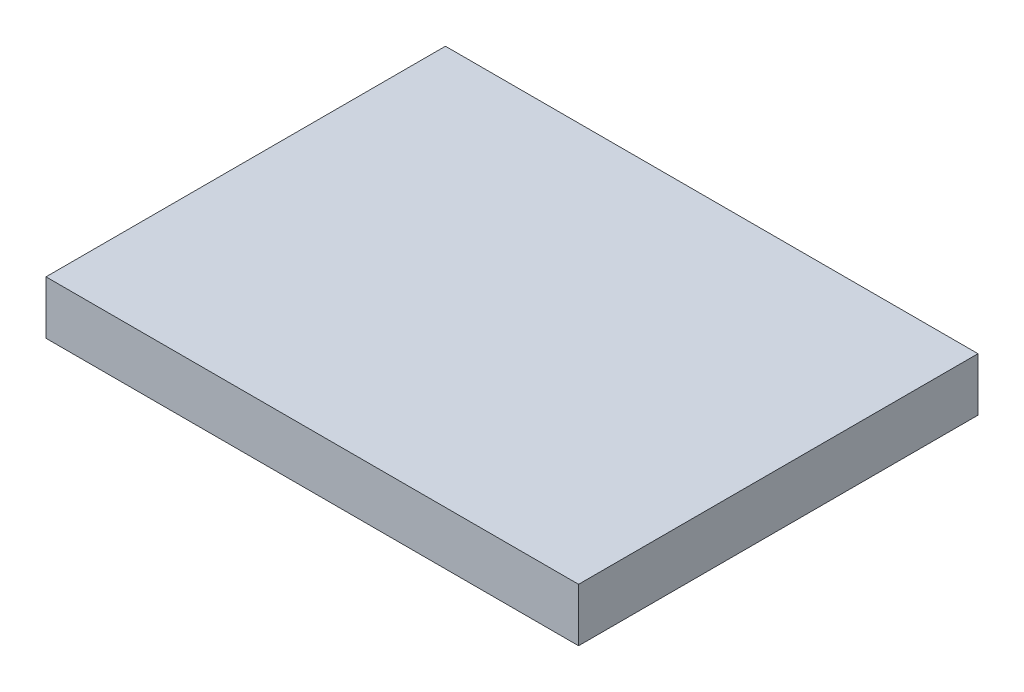
ISO-10303-21;
HEADER;
FILE_DESCRIPTION(('STEP AP214'),'2;1');
FILE_NAME('part.step','',(''),(''),'','','');
FILE_SCHEMA(('AUTOMOTIVE_DESIGN { 1 0 10303 214 1 1 1 1 }'));
ENDSEC;
DATA;
#1=APPLICATION_CONTEXT('core data for automotive mechanical design processes');
#2=APPLICATION_PROTOCOL_DEFINITION('international standard','automotive_design',2000,#1);
#3=PRODUCT_CONTEXT('',#1,'mechanical');
#4=PRODUCT('Part','Part','',(#3));
#5=PRODUCT_RELATED_PRODUCT_CATEGORY('part','',(#4));
#6=PRODUCT_DEFINITION_FORMATION('','',#4);
#7=PRODUCT_DEFINITION_CONTEXT('part definition',#1,'design');
#8=PRODUCT_DEFINITION('design','',#6,#7);
#9=PRODUCT_DEFINITION_SHAPE('','',#8);
#10=(LENGTH_UNIT() NAMED_UNIT(*) SI_UNIT(.MILLI.,.METRE.));
#11=(NAMED_UNIT(*) PLANE_ANGLE_UNIT() SI_UNIT($,.RADIAN.));
#12=(NAMED_UNIT(*) SI_UNIT($,.STERADIAN.) SOLID_ANGLE_UNIT());
#13=UNCERTAINTY_MEASURE_WITH_UNIT(LENGTH_MEASURE(1.E-05),#10,'distance_accuracy_value','');
#14=(GEOMETRIC_REPRESENTATION_CONTEXT(3) GLOBAL_UNCERTAINTY_ASSIGNED_CONTEXT((#13)) GLOBAL_UNIT_ASSIGNED_CONTEXT((#10,
#11,#12)) REPRESENTATION_CONTEXT('',''));
#15=CARTESIAN_POINT('',(0.,0.,0.));
#16=DIRECTION('',(0.,0.,1.));
#17=DIRECTION('',(1.,0.,0.));
#18=AXIS2_PLACEMENT_3D('',#15,#16,#17);
#19=CARTESIAN_POINT('',(0.,4.,0.));
#20=DIRECTION('',(-1.,0.,0.));
#21=DIRECTION('',(0.,0.,1.));
#22=AXIS2_PLACEMENT_3D('',#19,#20,#21);
#23=PLANE('',#22);
#24=DIRECTION('',(0.,0.,-1.));
#25=VECTOR('',#24,1.);
#26=CARTESIAN_POINT('',(0.,0.,0.));
#27=LINE('',#26,#25);
#28=CARTESIAN_POINT('',(0.,0.,0.));
#29=VERTEX_POINT('',#28);
#30=CARTESIAN_POINT('',(0.,0.,-30.));
#31=VERTEX_POINT('',#30);
#32=EDGE_CURVE('E99',#29,#31,#27,.T.);
#33=ORIENTED_EDGE('',*,*,#32,.T.);
#34=DIRECTION('',(0.,-1.,0.));
#35=VECTOR('',#34,1.);
#36=CARTESIAN_POINT('',(0.,4.,-30.));
#37=LINE('',#36,#35);
#38=CARTESIAN_POINT('',(0.,4.,-30.));
#39=VERTEX_POINT('',#38);
#40=EDGE_CURVE('E11',#39,#31,#37,.T.);
#41=ORIENTED_EDGE('',*,*,#40,.F.);
#42=DIRECTION('',(0.,0.,-1.));
#43=VECTOR('',#42,1.);
#44=CARTESIAN_POINT('',(0.,4.,0.));
#45=LINE('',#44,#43);
#46=CARTESIAN_POINT('',(0.,4.,0.));
#47=VERTEX_POINT('',#46);
#48=EDGE_CURVE('E87',#47,#39,#45,.T.);
#49=ORIENTED_EDGE('',*,*,#48,.F.);
#50=DIRECTION('',(0.,-1.,0.));
#51=VECTOR('',#50,1.);
#52=CARTESIAN_POINT('',(0.,4.,0.));
#53=LINE('',#52,#51);
#54=EDGE_CURVE('E95',#47,#29,#53,.T.);
#55=ORIENTED_EDGE('',*,*,#54,.T.);
#56=EDGE_LOOP('',(#33,#41,#49,#55));
#57=FACE_BOUND('',#56,.T.);
#58=ADVANCED_FACE('F36',(#57),#23,.F.);
#59=CARTESIAN_POINT('',(0.,4.,-30.));
#60=DIRECTION('',(0.,0.,1.));
#61=DIRECTION('',(1.,0.,0.));
#62=AXIS2_PLACEMENT_3D('',#59,#60,#61);
#63=PLANE('',#62);
#64=DIRECTION('',(-1.,0.,0.));
#65=VECTOR('',#64,1.);
#66=CARTESIAN_POINT('',(0.,0.,-30.));
#67=LINE('',#66,#65);
#68=CARTESIAN_POINT('',(-40.,0.,-30.));
#69=VERTEX_POINT('',#68);
#70=EDGE_CURVE('E91',#31,#69,#67,.T.);
#71=ORIENTED_EDGE('',*,*,#70,.T.);
#72=DIRECTION('',(0.,-1.,0.));
#73=VECTOR('',#72,1.);
#74=CARTESIAN_POINT('',(-40.,4.,-30.));
#75=LINE('',#74,#73);
#76=CARTESIAN_POINT('',(-40.,4.,-30.));
#77=VERTEX_POINT('',#76);
#78=EDGE_CURVE('E44',#77,#69,#75,.T.);
#79=ORIENTED_EDGE('',*,*,#78,.F.);
#80=DIRECTION('',(-1.,0.,0.));
#81=VECTOR('',#80,1.);
#82=CARTESIAN_POINT('',(0.,4.,-30.));
#83=LINE('',#82,#81);
#84=EDGE_CURVE('E82',#39,#77,#83,.T.);
#85=ORIENTED_EDGE('',*,*,#84,.F.);
#86=ORIENTED_EDGE('',*,*,#40,.T.);
#87=EDGE_LOOP('',(#71,#79,#85,#86));
#88=FACE_BOUND('',#87,.T.);
#89=ADVANCED_FACE('F90',(#88),#63,.F.);
#90=CARTESIAN_POINT('',(-40.,4.,0.));
#91=DIRECTION('',(1.,0.,0.));
#92=DIRECTION('',(0.,0.,-1.));
#93=AXIS2_PLACEMENT_3D('',#90,#91,#92);
#94=PLANE('',#93);
#95=DIRECTION('',(0.,0.,1.));
#96=VECTOR('',#95,1.);
#97=CARTESIAN_POINT('',(-40.,0.,0.));
#98=LINE('',#97,#96);
#99=CARTESIAN_POINT('',(-40.,0.,0.));
#100=VERTEX_POINT('',#99);
#101=EDGE_CURVE('E69',#69,#100,#98,.T.);
#102=ORIENTED_EDGE('',*,*,#101,.T.);
#103=DIRECTION('',(0.,-1.,0.));
#104=VECTOR('',#103,1.);
#105=CARTESIAN_POINT('',(-40.,4.,0.));
#106=LINE('',#105,#104);
#107=CARTESIAN_POINT('',(-40.,4.,0.));
#108=VERTEX_POINT('',#107);
#109=EDGE_CURVE('E92',#108,#100,#106,.T.);
#110=ORIENTED_EDGE('',*,*,#109,.F.);
#111=DIRECTION('',(0.,0.,1.));
#112=VECTOR('',#111,1.);
#113=CARTESIAN_POINT('',(-40.,4.,0.));
#114=LINE('',#113,#112);
#115=EDGE_CURVE('E85',#77,#108,#114,.T.);
#116=ORIENTED_EDGE('',*,*,#115,.F.);
#117=ORIENTED_EDGE('',*,*,#78,.T.);
#118=EDGE_LOOP('',(#102,#110,#116,#117));
#119=FACE_BOUND('',#118,.T.);
#120=ADVANCED_FACE('F93',(#119),#94,.F.);
#121=CARTESIAN_POINT('',(0.,4.,0.));
#122=DIRECTION('',(0.,0.,-1.));
#123=DIRECTION('',(-1.,0.,0.));
#124=AXIS2_PLACEMENT_3D('',#121,#122,#123);
#125=PLANE('',#124);
#126=DIRECTION('',(1.,0.,0.));
#127=VECTOR('',#126,1.);
#128=CARTESIAN_POINT('',(0.,0.,0.));
#129=LINE('',#128,#127);
#130=EDGE_CURVE('E75',#100,#29,#129,.T.);
#131=ORIENTED_EDGE('',*,*,#130,.T.);
#132=ORIENTED_EDGE('',*,*,#54,.F.);
#133=DIRECTION('',(1.,0.,0.));
#134=VECTOR('',#133,1.);
#135=CARTESIAN_POINT('',(0.,4.,0.));
#136=LINE('',#135,#134);
#137=EDGE_CURVE('E52',#108,#47,#136,.T.);
#138=ORIENTED_EDGE('',*,*,#137,.F.);
#139=ORIENTED_EDGE('',*,*,#109,.T.);
#140=EDGE_LOOP('',(#131,#132,#138,#139));
#141=FACE_BOUND('',#140,.T.);
#142=ADVANCED_FACE('F106',(#141),#125,.F.);
#143=CARTESIAN_POINT('',(0.,4.,0.));
#144=DIRECTION('',(0.,1.,0.));
#145=DIRECTION('',(0.,0.,1.));
#146=AXIS2_PLACEMENT_3D('',#143,#144,#145);
#147=PLANE('',#146);
#148=ORIENTED_EDGE('',*,*,#48,.T.);
#149=ORIENTED_EDGE('',*,*,#84,.T.);
#150=ORIENTED_EDGE('',*,*,#115,.T.);
#151=ORIENTED_EDGE('',*,*,#137,.T.);
#152=EDGE_LOOP('',(#148,#149,#150,#151));
#153=FACE_BOUND('',#152,.T.);
#154=ADVANCED_FACE('F83',(#153),#147,.T.);
#155=CARTESIAN_POINT('',(0.,0.,0.));
#156=DIRECTION('',(0.,1.,0.));
#157=DIRECTION('',(0.,0.,1.));
#158=AXIS2_PLACEMENT_3D('',#155,#156,#157);
#159=PLANE('',#158);
#160=ORIENTED_EDGE('',*,*,#32,.F.);
#161=ORIENTED_EDGE('',*,*,#130,.F.);
#162=ORIENTED_EDGE('',*,*,#101,.F.);
#163=ORIENTED_EDGE('',*,*,#70,.F.);
#164=EDGE_LOOP('',(#160,#161,#162,#163));
#165=FACE_BOUND('',#164,.T.);
#166=ADVANCED_FACE('F109',(#165),#159,.F.);
#167=CLOSED_SHELL('',(#58,#89,#120,#142,#154,#166));
#168=MANIFOLD_SOLID_BREP('B2',#167);
#169=ADVANCED_BREP_SHAPE_REPRESENTATION('',(#18,#168),#14);
#170=SHAPE_DEFINITION_REPRESENTATION(#9,#169);
ENDSEC;
END-ISO-10303-21;
